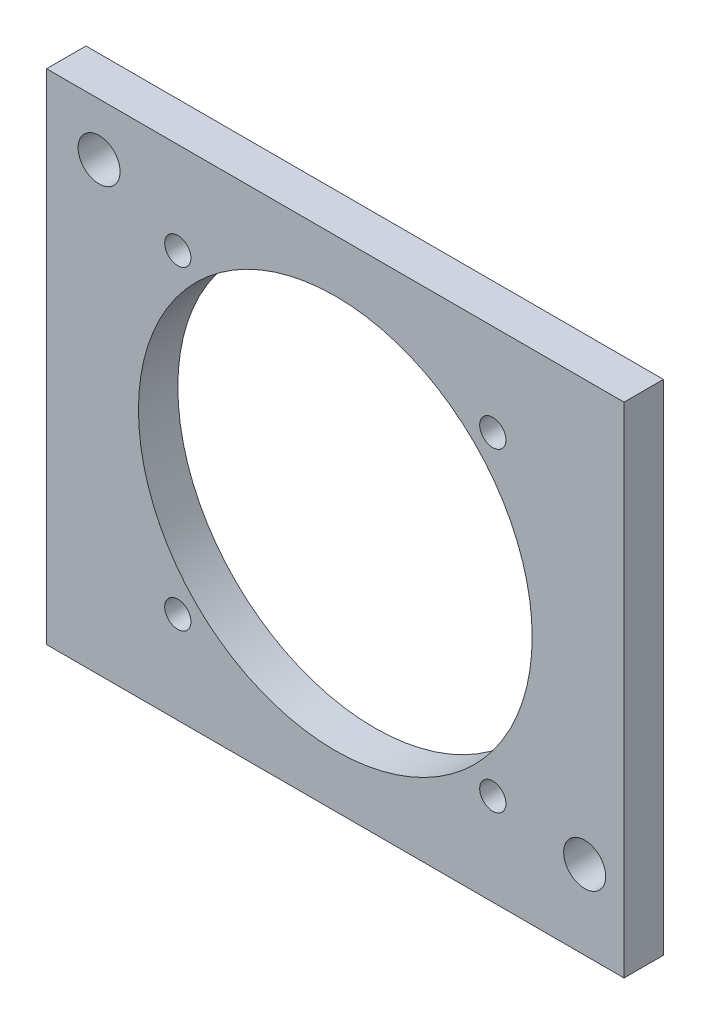
ISO-10303-21;
HEADER;
FILE_DESCRIPTION(('STEP AP214'),'2;1');
FILE_NAME('part.step','',(''),(''),'','','');
FILE_SCHEMA(('AUTOMOTIVE_DESIGN { 1 0 10303 214 1 1 1 1 }'));
ENDSEC;
DATA;
#1=APPLICATION_CONTEXT('core data for automotive mechanical design processes');
#2=APPLICATION_PROTOCOL_DEFINITION('international standard','automotive_design',2000,#1);
#3=PRODUCT_CONTEXT('',#1,'mechanical');
#4=PRODUCT('Part','Part','',(#3));
#5=PRODUCT_RELATED_PRODUCT_CATEGORY('part','',(#4));
#6=PRODUCT_DEFINITION_FORMATION('','',#4);
#7=PRODUCT_DEFINITION_CONTEXT('part definition',#1,'design');
#8=PRODUCT_DEFINITION('design','',#6,#7);
#9=PRODUCT_DEFINITION_SHAPE('','',#8);
#10=(LENGTH_UNIT() NAMED_UNIT(*) SI_UNIT(.MILLI.,.METRE.));
#11=(NAMED_UNIT(*) PLANE_ANGLE_UNIT() SI_UNIT($,.RADIAN.));
#12=(NAMED_UNIT(*) SI_UNIT($,.STERADIAN.) SOLID_ANGLE_UNIT());
#13=UNCERTAINTY_MEASURE_WITH_UNIT(LENGTH_MEASURE(1.E-05),#10,'distance_accuracy_value','');
#14=(GEOMETRIC_REPRESENTATION_CONTEXT(3) GLOBAL_UNCERTAINTY_ASSIGNED_CONTEXT((#13)) GLOBAL_UNIT_ASSIGNED_CONTEXT((#10,
#11,#12)) REPRESENTATION_CONTEXT('',''));
#15=CARTESIAN_POINT('',(0.,0.,0.));
#16=DIRECTION('',(0.,0.,1.));
#17=DIRECTION('',(1.,0.,0.));
#18=AXIS2_PLACEMENT_3D('',#15,#16,#17);
#19=CARTESIAN_POINT('',(110.,-95.,15.));
#20=DIRECTION('',(-1.,0.,0.));
#21=DIRECTION('',(0.,0.,1.));
#22=AXIS2_PLACEMENT_3D('',#19,#20,#21);
#23=PLANE('',#22);
#24=DIRECTION('',(0.,1.,0.));
#25=VECTOR('',#24,1.);
#26=CARTESIAN_POINT('',(110.,-95.,0.));
#27=LINE('',#26,#25);
#28=CARTESIAN_POINT('',(110.,-95.,0.));
#29=VERTEX_POINT('',#28);
#30=CARTESIAN_POINT('',(110.,95.,0.));
#31=VERTEX_POINT('',#30);
#32=EDGE_CURVE('E102',#29,#31,#27,.T.);
#33=ORIENTED_EDGE('',*,*,#32,.T.);
#34=DIRECTION('',(0.,0.,-1.));
#35=VECTOR('',#34,1.);
#36=CARTESIAN_POINT('',(110.,95.,15.));
#37=LINE('',#36,#35);
#38=CARTESIAN_POINT('',(110.,95.,15.));
#39=VERTEX_POINT('',#38);
#40=EDGE_CURVE('E11',#39,#31,#37,.T.);
#41=ORIENTED_EDGE('',*,*,#40,.F.);
#42=DIRECTION('',(0.,1.,0.));
#43=VECTOR('',#42,1.);
#44=CARTESIAN_POINT('',(110.,-95.,15.));
#45=LINE('',#44,#43);
#46=CARTESIAN_POINT('',(110.,-95.,15.));
#47=VERTEX_POINT('',#46);
#48=EDGE_CURVE('E90',#47,#39,#45,.T.);
#49=ORIENTED_EDGE('',*,*,#48,.F.);
#50=DIRECTION('',(0.,0.,-1.));
#51=VECTOR('',#50,1.);
#52=CARTESIAN_POINT('',(110.,-95.,15.));
#53=LINE('',#52,#51);
#54=EDGE_CURVE('E98',#47,#29,#53,.T.);
#55=ORIENTED_EDGE('',*,*,#54,.T.);
#56=EDGE_LOOP('',(#33,#41,#49,#55));
#57=FACE_BOUND('',#56,.T.);
#58=ADVANCED_FACE('F39',(#57),#23,.F.);
#59=CARTESIAN_POINT('',(-110.,95.,15.));
#60=DIRECTION('',(0.,-1.,0.));
#61=DIRECTION('',(0.,0.,-1.));
#62=AXIS2_PLACEMENT_3D('',#59,#60,#61);
#63=PLANE('',#62);
#64=DIRECTION('',(-1.,0.,0.));
#65=VECTOR('',#64,1.);
#66=CARTESIAN_POINT('',(-110.,95.,0.));
#67=LINE('',#66,#65);
#68=CARTESIAN_POINT('',(-110.,95.,0.));
#69=VERTEX_POINT('',#68);
#70=EDGE_CURVE('E94',#31,#69,#67,.T.);
#71=ORIENTED_EDGE('',*,*,#70,.T.);
#72=DIRECTION('',(0.,0.,-1.));
#73=VECTOR('',#72,1.);
#74=CARTESIAN_POINT('',(-110.,95.,15.));
#75=LINE('',#74,#73);
#76=CARTESIAN_POINT('',(-110.,95.,15.));
#77=VERTEX_POINT('',#76);
#78=EDGE_CURVE('E47',#77,#69,#75,.T.);
#79=ORIENTED_EDGE('',*,*,#78,.F.);
#80=DIRECTION('',(-1.,0.,0.));
#81=VECTOR('',#80,1.);
#82=CARTESIAN_POINT('',(-110.,95.,15.));
#83=LINE('',#82,#81);
#84=EDGE_CURVE('E85',#39,#77,#83,.T.);
#85=ORIENTED_EDGE('',*,*,#84,.F.);
#86=ORIENTED_EDGE('',*,*,#40,.T.);
#87=EDGE_LOOP('',(#71,#79,#85,#86));
#88=FACE_BOUND('',#87,.T.);
#89=ADVANCED_FACE('F93',(#88),#63,.F.);
#90=CARTESIAN_POINT('',(-110.,-95.,15.));
#91=DIRECTION('',(1.,0.,0.));
#92=DIRECTION('',(0.,0.,-1.));
#93=AXIS2_PLACEMENT_3D('',#90,#91,#92);
#94=PLANE('',#93);
#95=DIRECTION('',(0.,-1.,0.));
#96=VECTOR('',#95,1.);
#97=CARTESIAN_POINT('',(-110.,-95.,0.));
#98=LINE('',#97,#96);
#99=CARTESIAN_POINT('',(-110.,-95.,0.));
#100=VERTEX_POINT('',#99);
#101=EDGE_CURVE('E72',#69,#100,#98,.T.);
#102=ORIENTED_EDGE('',*,*,#101,.T.);
#103=DIRECTION('',(0.,0.,-1.));
#104=VECTOR('',#103,1.);
#105=CARTESIAN_POINT('',(-110.,-95.,15.));
#106=LINE('',#105,#104);
#107=CARTESIAN_POINT('',(-110.,-95.,15.));
#108=VERTEX_POINT('',#107);
#109=EDGE_CURVE('E95',#108,#100,#106,.T.);
#110=ORIENTED_EDGE('',*,*,#109,.F.);
#111=DIRECTION('',(0.,-1.,0.));
#112=VECTOR('',#111,1.);
#113=CARTESIAN_POINT('',(-110.,-95.,15.));
#114=LINE('',#113,#112);
#115=EDGE_CURVE('E88',#77,#108,#114,.T.);
#116=ORIENTED_EDGE('',*,*,#115,.F.);
#117=ORIENTED_EDGE('',*,*,#78,.T.);
#118=EDGE_LOOP('',(#102,#110,#116,#117));
#119=FACE_BOUND('',#118,.T.);
#120=ADVANCED_FACE('F96',(#119),#94,.F.);
#121=CARTESIAN_POINT('',(-110.,-95.,15.));
#122=DIRECTION('',(0.,1.,0.));
#123=DIRECTION('',(0.,0.,1.));
#124=AXIS2_PLACEMENT_3D('',#121,#122,#123);
#125=PLANE('',#124);
#126=DIRECTION('',(1.,0.,0.));
#127=VECTOR('',#126,1.);
#128=CARTESIAN_POINT('',(-110.,-95.,0.));
#129=LINE('',#128,#127);
#130=EDGE_CURVE('E78',#100,#29,#129,.T.);
#131=ORIENTED_EDGE('',*,*,#130,.T.);
#132=ORIENTED_EDGE('',*,*,#54,.F.);
#133=DIRECTION('',(1.,0.,0.));
#134=VECTOR('',#133,1.);
#135=CARTESIAN_POINT('',(-110.,-95.,15.));
#136=LINE('',#135,#134);
#137=EDGE_CURVE('E55',#108,#47,#136,.T.);
#138=ORIENTED_EDGE('',*,*,#137,.F.);
#139=ORIENTED_EDGE('',*,*,#109,.T.);
#140=EDGE_LOOP('',(#131,#132,#138,#139));
#141=FACE_BOUND('',#140,.T.);
#142=ADVANCED_FACE('F110',(#141),#125,.F.);
#143=CARTESIAN_POINT('',(0.,0.,15.));
#144=DIRECTION('',(0.,0.,-1.));
#145=DIRECTION('',(-1.,0.,0.));
#146=AXIS2_PLACEMENT_3D('',#143,#144,#145);
#147=PLANE('',#146);
#148=CARTESIAN_POINT('',(60.,60.,15.));
#149=DIRECTION('',(0.,0.,1.));
#150=DIRECTION('',(1.,0.,0.));
#151=AXIS2_PLACEMENT_3D('',#148,#149,#150);
#152=CIRCLE('',#151,5.);
#153=CARTESIAN_POINT('',(65.,60.,15.));
#154=VERTEX_POINT('',#153);
#155=EDGE_CURVE('E134',#154,#154,#152,.T.);
#156=ORIENTED_EDGE('',*,*,#155,.F.);
#157=EDGE_LOOP('',(#156));
#158=FACE_BOUND('',#157,.T.);
#159=CARTESIAN_POINT('',(-60.,60.,15.));
#160=DIRECTION('',(0.,0.,1.));
#161=DIRECTION('',(1.,0.,0.));
#162=AXIS2_PLACEMENT_3D('',#159,#160,#161);
#163=CIRCLE('',#162,5.);
#164=CARTESIAN_POINT('',(-55.,60.,15.));
#165=VERTEX_POINT('',#164);
#166=EDGE_CURVE('E129',#165,#165,#163,.T.);
#167=ORIENTED_EDGE('',*,*,#166,.F.);
#168=EDGE_LOOP('',(#167));
#169=FACE_BOUND('',#168,.T.);
#170=CARTESIAN_POINT('',(95.,-65.,15.));
#171=DIRECTION('',(0.,0.,1.));
#172=DIRECTION('',(-1.,0.,0.));
#173=AXIS2_PLACEMENT_3D('',#170,#171,#172);
#174=CIRCLE('',#173,8.00000000000001);
#175=CARTESIAN_POINT('',(87.,-65.,15.));
#176=VERTEX_POINT('',#175);
#177=EDGE_CURVE('E122',#176,#176,#174,.T.);
#178=ORIENTED_EDGE('',*,*,#177,.F.);
#179=EDGE_LOOP('',(#178));
#180=FACE_BOUND('',#179,.T.);
#181=CARTESIAN_POINT('',(-90.,75.,15.));
#182=DIRECTION('',(0.,0.,1.));
#183=DIRECTION('',(1.,0.,0.));
#184=AXIS2_PLACEMENT_3D('',#181,#182,#183);
#185=CIRCLE('',#184,8.00000000000003);
#186=CARTESIAN_POINT('',(-82.,75.,15.));
#187=VERTEX_POINT('',#186);
#188=EDGE_CURVE('E121',#187,#187,#185,.T.);
#189=ORIENTED_EDGE('',*,*,#188,.F.);
#190=EDGE_LOOP('',(#189));
#191=FACE_BOUND('',#190,.T.);
#192=CARTESIAN_POINT('',(60.,-60.,15.));
#193=DIRECTION('',(0.,0.,1.));
#194=DIRECTION('',(1.,0.,0.));
#195=AXIS2_PLACEMENT_3D('',#192,#193,#194);
#196=CIRCLE('',#195,5.);
#197=CARTESIAN_POINT('',(65.,-60.,15.));
#198=VERTEX_POINT('',#197);
#199=EDGE_CURVE('E141',#198,#198,#196,.T.);
#200=ORIENTED_EDGE('',*,*,#199,.F.);
#201=EDGE_LOOP('',(#200));
#202=FACE_BOUND('',#201,.T.);
#203=CARTESIAN_POINT('',(-60.,-60.,15.));
#204=DIRECTION('',(0.,0.,1.));
#205=DIRECTION('',(1.,0.,0.));
#206=AXIS2_PLACEMENT_3D('',#203,#204,#205);
#207=CIRCLE('',#206,5.);
#208=CARTESIAN_POINT('',(-55.,-60.,15.));
#209=VERTEX_POINT('',#208);
#210=EDGE_CURVE('E146',#209,#209,#207,.T.);
#211=ORIENTED_EDGE('',*,*,#210,.F.);
#212=EDGE_LOOP('',(#211));
#213=FACE_BOUND('',#212,.T.);
#214=CARTESIAN_POINT('',(0.,0.,15.));
#215=DIRECTION('',(0.,0.,1.));
#216=DIRECTION('',(1.,0.,0.));
#217=AXIS2_PLACEMENT_3D('',#214,#215,#216);
#218=CIRCLE('',#217,75.);
#219=CARTESIAN_POINT('',(75.,0.,15.));
#220=VERTEX_POINT('',#219);
#221=EDGE_CURVE('E118',#220,#220,#218,.T.);
#222=ORIENTED_EDGE('',*,*,#221,.F.);
#223=EDGE_LOOP('',(#222));
#224=FACE_BOUND('',#223,.T.);
#225=ORIENTED_EDGE('',*,*,#48,.T.);
#226=ORIENTED_EDGE('',*,*,#84,.T.);
#227=ORIENTED_EDGE('',*,*,#115,.T.);
#228=ORIENTED_EDGE('',*,*,#137,.T.);
#229=EDGE_LOOP('',(#225,#226,#227,#228));
#230=FACE_BOUND('',#229,.T.);
#231=ADVANCED_FACE('F86',(#158,#169,#180,#191,#202,#213,#224,#230),#147,.F.);
#232=CARTESIAN_POINT('',(0.,0.,0.));
#233=DIRECTION('',(0.,0.,-1.));
#234=DIRECTION('',(-1.,0.,0.));
#235=AXIS2_PLACEMENT_3D('',#232,#233,#234);
#236=PLANE('',#235);
#237=CARTESIAN_POINT('',(60.,60.,0.));
#238=DIRECTION('',(0.,0.,-1.));
#239=DIRECTION('',(-1.,0.,0.));
#240=AXIS2_PLACEMENT_3D('',#237,#238,#239);
#241=CIRCLE('',#240,5.);
#242=CARTESIAN_POINT('',(55.,60.,0.));
#243=VERTEX_POINT('',#242);
#244=EDGE_CURVE('E138',#243,#243,#241,.F.);
#245=ORIENTED_EDGE('',*,*,#244,.T.);
#246=EDGE_LOOP('',(#245));
#247=FACE_BOUND('',#246,.T.);
#248=CARTESIAN_POINT('',(-60.,60.,0.));
#249=DIRECTION('',(0.,0.,-1.));
#250=DIRECTION('',(-1.,0.,0.));
#251=AXIS2_PLACEMENT_3D('',#248,#249,#250);
#252=CIRCLE('',#251,5.);
#253=CARTESIAN_POINT('',(-65.,60.,0.));
#254=VERTEX_POINT('',#253);
#255=EDGE_CURVE('E137',#254,#254,#252,.F.);
#256=ORIENTED_EDGE('',*,*,#255,.T.);
#257=EDGE_LOOP('',(#256));
#258=FACE_BOUND('',#257,.T.);
#259=CARTESIAN_POINT('',(95.,-65.,0.));
#260=DIRECTION('',(0.,0.,-1.));
#261=DIRECTION('',(-1.,0.,0.));
#262=AXIS2_PLACEMENT_3D('',#259,#260,#261);
#263=CIRCLE('',#262,8.00000000000001);
#264=CARTESIAN_POINT('',(87.,-65.,0.));
#265=VERTEX_POINT('',#264);
#266=EDGE_CURVE('E126',#265,#265,#263,.F.);
#267=ORIENTED_EDGE('',*,*,#266,.T.);
#268=EDGE_LOOP('',(#267));
#269=FACE_BOUND('',#268,.T.);
#270=CARTESIAN_POINT('',(-90.,75.,0.));
#271=DIRECTION('',(0.,0.,-1.));
#272=DIRECTION('',(-1.,0.,0.));
#273=AXIS2_PLACEMENT_3D('',#270,#271,#272);
#274=CIRCLE('',#273,8.00000000000003);
#275=CARTESIAN_POINT('',(-98.,75.,0.));
#276=VERTEX_POINT('',#275);
#277=EDGE_CURVE('E125',#276,#276,#274,.F.);
#278=ORIENTED_EDGE('',*,*,#277,.T.);
#279=EDGE_LOOP('',(#278));
#280=FACE_BOUND('',#279,.T.);
#281=CARTESIAN_POINT('',(60.,-60.,0.));
#282=DIRECTION('',(0.,0.,-1.));
#283=DIRECTION('',(-1.,0.,0.));
#284=AXIS2_PLACEMENT_3D('',#281,#282,#283);
#285=CIRCLE('',#284,5.);
#286=CARTESIAN_POINT('',(55.,-60.,0.));
#287=VERTEX_POINT('',#286);
#288=EDGE_CURVE('E149',#287,#287,#285,.F.);
#289=ORIENTED_EDGE('',*,*,#288,.T.);
#290=EDGE_LOOP('',(#289));
#291=FACE_BOUND('',#290,.T.);
#292=CARTESIAN_POINT('',(-60.,-60.,0.));
#293=DIRECTION('',(0.,0.,-1.));
#294=DIRECTION('',(-1.,0.,0.));
#295=AXIS2_PLACEMENT_3D('',#292,#293,#294);
#296=CIRCLE('',#295,5.);
#297=CARTESIAN_POINT('',(-65.,-60.,0.));
#298=VERTEX_POINT('',#297);
#299=EDGE_CURVE('E150',#298,#298,#296,.F.);
#300=ORIENTED_EDGE('',*,*,#299,.T.);
#301=EDGE_LOOP('',(#300));
#302=FACE_BOUND('',#301,.T.);
#303=CARTESIAN_POINT('',(0.,0.,0.));
#304=DIRECTION('',(0.,0.,-1.));
#305=DIRECTION('',(-1.,0.,0.));
#306=AXIS2_PLACEMENT_3D('',#303,#304,#305);
#307=CIRCLE('',#306,75.);
#308=CARTESIAN_POINT('',(-75.,0.,0.));
#309=VERTEX_POINT('',#308);
#310=EDGE_CURVE('E105',#309,#309,#307,.F.);
#311=ORIENTED_EDGE('',*,*,#310,.T.);
#312=EDGE_LOOP('',(#311));
#313=FACE_BOUND('',#312,.T.);
#314=ORIENTED_EDGE('',*,*,#32,.F.);
#315=ORIENTED_EDGE('',*,*,#130,.F.);
#316=ORIENTED_EDGE('',*,*,#101,.F.);
#317=ORIENTED_EDGE('',*,*,#70,.F.);
#318=EDGE_LOOP('',(#314,#315,#316,#317));
#319=FACE_BOUND('',#318,.T.);
#320=ADVANCED_FACE('F113',(#247,#258,#269,#280,#291,#302,#313,#319),#236,.T.);
#321=CARTESIAN_POINT('',(0.,0.,-212.132034355964));
#322=DIRECTION('',(0.,0.,1.));
#323=DIRECTION('',(1.,0.,0.));
#324=AXIS2_PLACEMENT_3D('',#321,#322,#323);
#325=CYLINDRICAL_SURFACE('',#324,75.);
#326=ORIENTED_EDGE('',*,*,#221,.T.);
#327=EDGE_LOOP('',(#326));
#328=FACE_BOUND('',#327,.T.);
#329=ORIENTED_EDGE('',*,*,#310,.F.);
#330=EDGE_LOOP('',(#329));
#331=FACE_BOUND('',#330,.T.);
#332=ADVANCED_FACE('F173',(#328,#331),#325,.F.);
#333=CARTESIAN_POINT('',(-60.,-60.,-212.132034355964));
#334=DIRECTION('',(0.,0.,1.));
#335=DIRECTION('',(1.,0.,0.));
#336=AXIS2_PLACEMENT_3D('',#333,#334,#335);
#337=CYLINDRICAL_SURFACE('',#336,5.);
#338=ORIENTED_EDGE('',*,*,#210,.T.);
#339=EDGE_LOOP('',(#338));
#340=FACE_BOUND('',#339,.T.);
#341=ORIENTED_EDGE('',*,*,#299,.F.);
#342=EDGE_LOOP('',(#341));
#343=FACE_BOUND('',#342,.T.);
#344=ADVANCED_FACE('F163',(#340,#343),#337,.F.);
#345=CARTESIAN_POINT('',(60.,-60.,-212.132034355964));
#346=DIRECTION('',(0.,0.,1.));
#347=DIRECTION('',(1.,0.,0.));
#348=AXIS2_PLACEMENT_3D('',#345,#346,#347);
#349=CYLINDRICAL_SURFACE('',#348,5.);
#350=ORIENTED_EDGE('',*,*,#199,.T.);
#351=EDGE_LOOP('',(#350));
#352=FACE_BOUND('',#351,.T.);
#353=ORIENTED_EDGE('',*,*,#288,.F.);
#354=EDGE_LOOP('',(#353));
#355=FACE_BOUND('',#354,.T.);
#356=ADVANCED_FACE('F160',(#352,#355),#349,.F.);
#357=CARTESIAN_POINT('',(-90.,75.,-212.132034355964));
#358=DIRECTION('',(0.,0.,1.));
#359=DIRECTION('',(1.,0.,0.));
#360=AXIS2_PLACEMENT_3D('',#357,#358,#359);
#361=CYLINDRICAL_SURFACE('',#360,8.00000000000003);
#362=ORIENTED_EDGE('',*,*,#188,.T.);
#363=EDGE_LOOP('',(#362));
#364=FACE_BOUND('',#363,.T.);
#365=ORIENTED_EDGE('',*,*,#277,.F.);
#366=EDGE_LOOP('',(#365));
#367=FACE_BOUND('',#366,.T.);
#368=ADVANCED_FACE('F162',(#364,#367),#361,.F.);
#369=CARTESIAN_POINT('',(95.,-65.,-212.132034355964));
#370=DIRECTION('',(0.,0.,1.));
#371=DIRECTION('',(1.,0.,0.));
#372=AXIS2_PLACEMENT_3D('',#369,#370,#371);
#373=CYLINDRICAL_SURFACE('',#372,8.00000000000001);
#374=ORIENTED_EDGE('',*,*,#177,.T.);
#375=EDGE_LOOP('',(#374));
#376=FACE_BOUND('',#375,.T.);
#377=ORIENTED_EDGE('',*,*,#266,.F.);
#378=EDGE_LOOP('',(#377));
#379=FACE_BOUND('',#378,.T.);
#380=ADVANCED_FACE('F170',(#376,#379),#373,.F.);
#381=CARTESIAN_POINT('',(-60.,60.,-212.132034355964));
#382=DIRECTION('',(0.,0.,1.));
#383=DIRECTION('',(1.,0.,0.));
#384=AXIS2_PLACEMENT_3D('',#381,#382,#383);
#385=CYLINDRICAL_SURFACE('',#384,5.);
#386=ORIENTED_EDGE('',*,*,#166,.T.);
#387=EDGE_LOOP('',(#386));
#388=FACE_BOUND('',#387,.T.);
#389=ORIENTED_EDGE('',*,*,#255,.F.);
#390=EDGE_LOOP('',(#389));
#391=FACE_BOUND('',#390,.T.);
#392=ADVANCED_FACE('F197',(#388,#391),#385,.F.);
#393=CARTESIAN_POINT('',(60.,60.,-212.132034355964));
#394=DIRECTION('',(0.,0.,1.));
#395=DIRECTION('',(1.,0.,0.));
#396=AXIS2_PLACEMENT_3D('',#393,#394,#395);
#397=CYLINDRICAL_SURFACE('',#396,5.);
#398=ORIENTED_EDGE('',*,*,#155,.T.);
#399=EDGE_LOOP('',(#398));
#400=FACE_BOUND('',#399,.T.);
#401=ORIENTED_EDGE('',*,*,#244,.F.);
#402=EDGE_LOOP('',(#401));
#403=FACE_BOUND('',#402,.T.);
#404=ADVANCED_FACE('F200',(#400,#403),#397,.F.);
#405=CLOSED_SHELL('',(#58,#89,#120,#142,#231,#320,#332,#344,#356,#368,#380,#392,#404));
#406=MANIFOLD_SOLID_BREP('B2',#405);
#407=ADVANCED_BREP_SHAPE_REPRESENTATION('',(#18,#406),#14);
#408=SHAPE_DEFINITION_REPRESENTATION(#9,#407);
ENDSEC;
END-ISO-10303-21;
